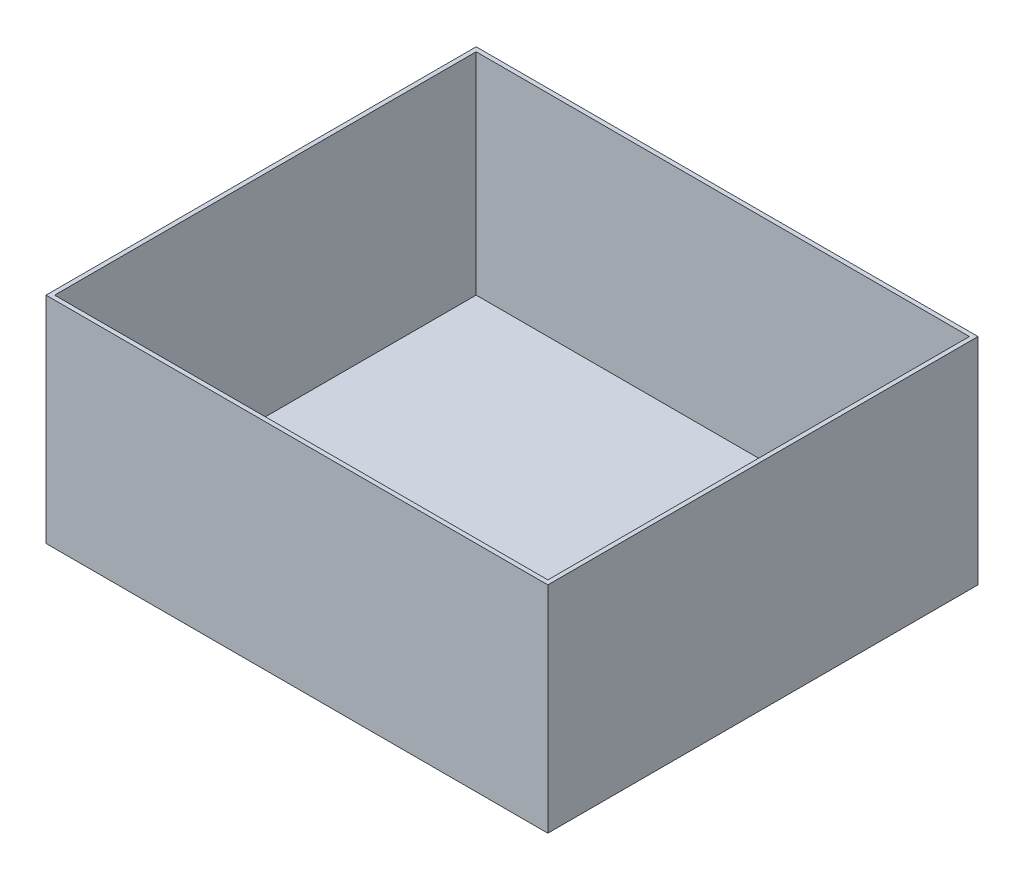
ISO-10303-21;
HEADER;
FILE_DESCRIPTION(('STEP AP214'),'2;1');
FILE_NAME('part.step','',(''),(''),'','','');
FILE_SCHEMA(('AUTOMOTIVE_DESIGN { 1 0 10303 214 1 1 1 1 }'));
ENDSEC;
DATA;
#1=APPLICATION_CONTEXT('core data for automotive mechanical design processes');
#2=APPLICATION_PROTOCOL_DEFINITION('international standard','automotive_design',2000,#1);
#3=PRODUCT_CONTEXT('',#1,'mechanical');
#4=PRODUCT('Part','Part','',(#3));
#5=PRODUCT_RELATED_PRODUCT_CATEGORY('part','',(#4));
#6=PRODUCT_DEFINITION_FORMATION('','',#4);
#7=PRODUCT_DEFINITION_CONTEXT('part definition',#1,'design');
#8=PRODUCT_DEFINITION('design','',#6,#7);
#9=PRODUCT_DEFINITION_SHAPE('','',#8);
#10=(LENGTH_UNIT() NAMED_UNIT(*) SI_UNIT(.MILLI.,.METRE.));
#11=(NAMED_UNIT(*) PLANE_ANGLE_UNIT() SI_UNIT($,.RADIAN.));
#12=(NAMED_UNIT(*) SI_UNIT($,.STERADIAN.) SOLID_ANGLE_UNIT());
#13=UNCERTAINTY_MEASURE_WITH_UNIT(LENGTH_MEASURE(1.E-05),#10,'distance_accuracy_value','');
#14=(GEOMETRIC_REPRESENTATION_CONTEXT(3) GLOBAL_UNCERTAINTY_ASSIGNED_CONTEXT((#13)) GLOBAL_UNIT_ASSIGNED_CONTEXT((#10,
#11,#12)) REPRESENTATION_CONTEXT('',''));
#15=CARTESIAN_POINT('',(0.,0.,0.));
#16=DIRECTION('',(0.,0.,1.));
#17=DIRECTION('',(1.,0.,0.));
#18=AXIS2_PLACEMENT_3D('',#15,#16,#17);
#19=CARTESIAN_POINT('',(0.,150.,0.));
#20=DIRECTION('',(0.,1.,0.));
#21=DIRECTION('',(0.,0.,1.));
#22=AXIS2_PLACEMENT_3D('',#19,#20,#21);
#23=PLANE('',#22);
#24=DIRECTION('',(1.,0.,0.));
#25=VECTOR('',#24,1.);
#26=CARTESIAN_POINT('',(0.,150.,150.));
#27=LINE('',#26,#25);
#28=CARTESIAN_POINT('',(-175.,150.,150.));
#29=VERTEX_POINT('',#28);
#30=CARTESIAN_POINT('',(175.,150.,150.));
#31=VERTEX_POINT('',#30);
#32=EDGE_CURVE('E164',#29,#31,#27,.T.);
#33=ORIENTED_EDGE('',*,*,#32,.T.);
#34=DIRECTION('',(0.,0.,-1.));
#35=VECTOR('',#34,1.);
#36=CARTESIAN_POINT('',(175.,150.,0.));
#37=LINE('',#36,#35);
#38=CARTESIAN_POINT('',(175.,150.,-150.));
#39=VERTEX_POINT('',#38);
#40=EDGE_CURVE('E168',#31,#39,#37,.T.);
#41=ORIENTED_EDGE('',*,*,#40,.T.);
#42=DIRECTION('',(1.,0.,0.));
#43=VECTOR('',#42,1.);
#44=CARTESIAN_POINT('',(0.,150.,-150.));
#45=LINE('',#44,#43);
#46=CARTESIAN_POINT('',(-175.,150.,-150.));
#47=VERTEX_POINT('',#46);
#48=EDGE_CURVE('E172',#47,#39,#45,.T.);
#49=ORIENTED_EDGE('',*,*,#48,.F.);
#50=DIRECTION('',(0.,0.,-1.));
#51=VECTOR('',#50,1.);
#52=CARTESIAN_POINT('',(-175.,150.,0.));
#53=LINE('',#52,#51);
#54=EDGE_CURVE('E176',#29,#47,#53,.T.);
#55=ORIENTED_EDGE('',*,*,#54,.F.);
#56=EDGE_LOOP('',(#33,#41,#49,#55));
#57=FACE_BOUND('',#56,.T.);
#58=DIRECTION('',(0.,0.,-1.));
#59=VECTOR('',#58,1.);
#60=CARTESIAN_POINT('',(172.,150.,0.));
#61=LINE('',#60,#59);
#62=CARTESIAN_POINT('',(172.,150.,147.));
#63=VERTEX_POINT('',#62);
#64=CARTESIAN_POINT('',(172.,150.,-147.));
#65=VERTEX_POINT('',#64);
#66=EDGE_CURVE('E226',#63,#65,#61,.T.);
#67=ORIENTED_EDGE('',*,*,#66,.F.);
#68=DIRECTION('',(1.,0.,0.));
#69=VECTOR('',#68,1.);
#70=CARTESIAN_POINT('',(0.,150.,147.));
#71=LINE('',#70,#69);
#72=CARTESIAN_POINT('',(-172.,150.,147.));
#73=VERTEX_POINT('',#72);
#74=EDGE_CURVE('E141',#73,#63,#71,.T.);
#75=ORIENTED_EDGE('',*,*,#74,.F.);
#76=DIRECTION('',(0.,0.,-1.));
#77=VECTOR('',#76,1.);
#78=CARTESIAN_POINT('',(-172.,150.,0.));
#79=LINE('',#78,#77);
#80=CARTESIAN_POINT('',(-172.,150.,-147.));
#81=VERTEX_POINT('',#80);
#82=EDGE_CURVE('E146',#73,#81,#79,.T.);
#83=ORIENTED_EDGE('',*,*,#82,.T.);
#84=DIRECTION('',(1.,0.,0.));
#85=VECTOR('',#84,1.);
#86=CARTESIAN_POINT('',(0.,150.,-147.));
#87=LINE('',#86,#85);
#88=EDGE_CURVE('E86',#81,#65,#87,.T.);
#89=ORIENTED_EDGE('',*,*,#88,.T.);
#90=EDGE_LOOP('',(#67,#75,#83,#89));
#91=FACE_BOUND('',#90,.T.);
#92=ADVANCED_FACE('F63',(#57,#91),#23,.T.);
#93=CARTESIAN_POINT('',(0.,0.,0.));
#94=DIRECTION('',(0.,1.,0.));
#95=DIRECTION('',(0.,0.,1.));
#96=AXIS2_PLACEMENT_3D('',#93,#94,#95);
#97=PLANE('',#96);
#98=DIRECTION('',(1.,0.,0.));
#99=VECTOR('',#98,1.);
#100=CARTESIAN_POINT('',(0.,0.,150.));
#101=LINE('',#100,#99);
#102=CARTESIAN_POINT('',(-175.,0.,150.));
#103=VERTEX_POINT('',#102);
#104=CARTESIAN_POINT('',(175.,0.,150.));
#105=VERTEX_POINT('',#104);
#106=EDGE_CURVE('E163',#103,#105,#101,.T.);
#107=ORIENTED_EDGE('',*,*,#106,.F.);
#108=DIRECTION('',(0.,0.,-1.));
#109=VECTOR('',#108,1.);
#110=CARTESIAN_POINT('',(-175.,0.,0.));
#111=LINE('',#110,#109);
#112=CARTESIAN_POINT('',(-175.,0.,-150.));
#113=VERTEX_POINT('',#112);
#114=EDGE_CURVE('E169',#103,#113,#111,.T.);
#115=ORIENTED_EDGE('',*,*,#114,.T.);
#116=DIRECTION('',(1.,0.,0.));
#117=VECTOR('',#116,1.);
#118=CARTESIAN_POINT('',(0.,0.,-150.));
#119=LINE('',#118,#117);
#120=CARTESIAN_POINT('',(175.,0.,-150.));
#121=VERTEX_POINT('',#120);
#122=EDGE_CURVE('E188',#113,#121,#119,.T.);
#123=ORIENTED_EDGE('',*,*,#122,.T.);
#124=DIRECTION('',(0.,0.,-1.));
#125=VECTOR('',#124,1.);
#126=CARTESIAN_POINT('',(175.,0.,0.));
#127=LINE('',#126,#125);
#128=EDGE_CURVE('E184',#105,#121,#127,.T.);
#129=ORIENTED_EDGE('',*,*,#128,.F.);
#130=EDGE_LOOP('',(#107,#115,#123,#129));
#131=FACE_BOUND('',#130,.T.);
#132=ADVANCED_FACE('F212',(#131),#97,.F.);
#133=CARTESIAN_POINT('',(0.,150.,150.));
#134=DIRECTION('',(0.,0.,-1.));
#135=DIRECTION('',(-1.,0.,0.));
#136=AXIS2_PLACEMENT_3D('',#133,#134,#135);
#137=PLANE('',#136);
#138=DIRECTION('',(0.,-1.,0.));
#139=VECTOR('',#138,1.);
#140=CARTESIAN_POINT('',(-175.,150.,150.));
#141=LINE('',#140,#139);
#142=EDGE_CURVE('E180',#29,#103,#141,.T.);
#143=ORIENTED_EDGE('',*,*,#142,.T.);
#144=ORIENTED_EDGE('',*,*,#106,.T.);
#145=DIRECTION('',(0.,-1.,0.));
#146=VECTOR('',#145,1.);
#147=CARTESIAN_POINT('',(175.,150.,150.));
#148=LINE('',#147,#146);
#149=EDGE_CURVE('E72',#31,#105,#148,.T.);
#150=ORIENTED_EDGE('',*,*,#149,.F.);
#151=ORIENTED_EDGE('',*,*,#32,.F.);
#152=EDGE_LOOP('',(#143,#144,#150,#151));
#153=FACE_BOUND('',#152,.T.);
#154=ADVANCED_FACE('F65',(#153),#137,.F.);
#155=CARTESIAN_POINT('',(175.,150.,0.));
#156=DIRECTION('',(-1.,0.,0.));
#157=DIRECTION('',(0.,0.,1.));
#158=AXIS2_PLACEMENT_3D('',#155,#156,#157);
#159=PLANE('',#158);
#160=ORIENTED_EDGE('',*,*,#149,.T.);
#161=ORIENTED_EDGE('',*,*,#128,.T.);
#162=DIRECTION('',(0.,-1.,0.));
#163=VECTOR('',#162,1.);
#164=CARTESIAN_POINT('',(175.,150.,-150.));
#165=LINE('',#164,#163);
#166=EDGE_CURVE('E200',#39,#121,#165,.T.);
#167=ORIENTED_EDGE('',*,*,#166,.F.);
#168=ORIENTED_EDGE('',*,*,#40,.F.);
#169=EDGE_LOOP('',(#160,#161,#167,#168));
#170=FACE_BOUND('',#169,.T.);
#171=ADVANCED_FACE('F206',(#170),#159,.F.);
#172=CARTESIAN_POINT('',(0.,150.,-150.));
#173=DIRECTION('',(0.,0.,-1.));
#174=DIRECTION('',(-1.,0.,0.));
#175=AXIS2_PLACEMENT_3D('',#172,#173,#174);
#176=PLANE('',#175);
#177=ORIENTED_EDGE('',*,*,#166,.T.);
#178=ORIENTED_EDGE('',*,*,#122,.F.);
#179=DIRECTION('',(0.,-1.,0.));
#180=VECTOR('',#179,1.);
#181=CARTESIAN_POINT('',(-175.,150.,-150.));
#182=LINE('',#181,#180);
#183=EDGE_CURVE('E197',#47,#113,#182,.T.);
#184=ORIENTED_EDGE('',*,*,#183,.F.);
#185=ORIENTED_EDGE('',*,*,#48,.T.);
#186=EDGE_LOOP('',(#177,#178,#184,#185));
#187=FACE_BOUND('',#186,.T.);
#188=ADVANCED_FACE('F220',(#187),#176,.T.);
#189=CARTESIAN_POINT('',(-175.,150.,0.));
#190=DIRECTION('',(-1.,0.,0.));
#191=DIRECTION('',(0.,0.,1.));
#192=AXIS2_PLACEMENT_3D('',#189,#190,#191);
#193=PLANE('',#192);
#194=ORIENTED_EDGE('',*,*,#183,.T.);
#195=ORIENTED_EDGE('',*,*,#114,.F.);
#196=ORIENTED_EDGE('',*,*,#142,.F.);
#197=ORIENTED_EDGE('',*,*,#54,.T.);
#198=EDGE_LOOP('',(#194,#195,#196,#197));
#199=FACE_BOUND('',#198,.T.);
#200=ADVANCED_FACE('F217',(#199),#193,.T.);
#201=CARTESIAN_POINT('',(0.,150.,147.));
#202=DIRECTION('',(0.,0.,-1.));
#203=DIRECTION('',(-1.,0.,0.));
#204=AXIS2_PLACEMENT_3D('',#201,#202,#203);
#205=PLANE('',#204);
#206=DIRECTION('',(1.,0.,0.));
#207=VECTOR('',#206,1.);
#208=CARTESIAN_POINT('',(0.,3.,147.));
#209=LINE('',#208,#207);
#210=CARTESIAN_POINT('',(-172.,3.,147.));
#211=VERTEX_POINT('',#210);
#212=CARTESIAN_POINT('',(172.,3.,147.));
#213=VERTEX_POINT('',#212);
#214=EDGE_CURVE('E129',#211,#213,#209,.T.);
#215=ORIENTED_EDGE('',*,*,#214,.F.);
#216=DIRECTION('',(0.,-1.,0.));
#217=VECTOR('',#216,1.);
#218=CARTESIAN_POINT('',(-172.,150.,147.));
#219=LINE('',#218,#217);
#220=EDGE_CURVE('E136',#73,#211,#219,.T.);
#221=ORIENTED_EDGE('',*,*,#220,.F.);
#222=ORIENTED_EDGE('',*,*,#74,.T.);
#223=DIRECTION('',(0.,-1.,0.));
#224=VECTOR('',#223,1.);
#225=CARTESIAN_POINT('',(172.,150.,147.));
#226=LINE('',#225,#224);
#227=EDGE_CURVE('E139',#63,#213,#226,.T.);
#228=ORIENTED_EDGE('',*,*,#227,.T.);
#229=EDGE_LOOP('',(#215,#221,#222,#228));
#230=FACE_BOUND('',#229,.T.);
#231=ADVANCED_FACE('F135',(#230),#205,.T.);
#232=CARTESIAN_POINT('',(172.,150.,0.));
#233=DIRECTION('',(-1.,0.,0.));
#234=DIRECTION('',(0.,0.,1.));
#235=AXIS2_PLACEMENT_3D('',#232,#233,#234);
#236=PLANE('',#235);
#237=DIRECTION('',(0.,0.,-1.));
#238=VECTOR('',#237,1.);
#239=CARTESIAN_POINT('',(172.,3.,0.));
#240=LINE('',#239,#238);
#241=CARTESIAN_POINT('',(172.,3.,-147.));
#242=VERTEX_POINT('',#241);
#243=EDGE_CURVE('E142',#213,#242,#240,.T.);
#244=ORIENTED_EDGE('',*,*,#243,.F.);
#245=ORIENTED_EDGE('',*,*,#227,.F.);
#246=ORIENTED_EDGE('',*,*,#66,.T.);
#247=DIRECTION('',(0.,-1.,0.));
#248=VECTOR('',#247,1.);
#249=CARTESIAN_POINT('',(172.,150.,-147.));
#250=LINE('',#249,#248);
#251=EDGE_CURVE('E153',#65,#242,#250,.T.);
#252=ORIENTED_EDGE('',*,*,#251,.T.);
#253=EDGE_LOOP('',(#244,#245,#246,#252));
#254=FACE_BOUND('',#253,.T.);
#255=ADVANCED_FACE('F238',(#254),#236,.T.);
#256=CARTESIAN_POINT('',(0.,150.,-147.));
#257=DIRECTION('',(0.,0.,-1.));
#258=DIRECTION('',(-1.,0.,0.));
#259=AXIS2_PLACEMENT_3D('',#256,#257,#258);
#260=PLANE('',#259);
#261=DIRECTION('',(0.,-1.,0.));
#262=VECTOR('',#261,1.);
#263=CARTESIAN_POINT('',(-172.,150.,-147.));
#264=LINE('',#263,#262);
#265=CARTESIAN_POINT('',(-172.,3.,-147.));
#266=VERTEX_POINT('',#265);
#267=EDGE_CURVE('E149',#81,#266,#264,.T.);
#268=ORIENTED_EDGE('',*,*,#267,.T.);
#269=DIRECTION('',(1.,0.,0.));
#270=VECTOR('',#269,1.);
#271=CARTESIAN_POINT('',(0.,3.,-147.));
#272=LINE('',#271,#270);
#273=EDGE_CURVE('E79',#266,#242,#272,.T.);
#274=ORIENTED_EDGE('',*,*,#273,.T.);
#275=ORIENTED_EDGE('',*,*,#251,.F.);
#276=ORIENTED_EDGE('',*,*,#88,.F.);
#277=EDGE_LOOP('',(#268,#274,#275,#276));
#278=FACE_BOUND('',#277,.T.);
#279=ADVANCED_FACE('F237',(#278),#260,.F.);
#280=CARTESIAN_POINT('',(-172.,150.,0.));
#281=DIRECTION('',(-1.,0.,0.));
#282=DIRECTION('',(0.,0.,1.));
#283=AXIS2_PLACEMENT_3D('',#280,#281,#282);
#284=PLANE('',#283);
#285=ORIENTED_EDGE('',*,*,#220,.T.);
#286=DIRECTION('',(0.,0.,-1.));
#287=VECTOR('',#286,1.);
#288=CARTESIAN_POINT('',(-172.,3.,0.));
#289=LINE('',#288,#287);
#290=EDGE_CURVE('E12',#211,#266,#289,.T.);
#291=ORIENTED_EDGE('',*,*,#290,.T.);
#292=ORIENTED_EDGE('',*,*,#267,.F.);
#293=ORIENTED_EDGE('',*,*,#82,.F.);
#294=EDGE_LOOP('',(#285,#291,#292,#293));
#295=FACE_BOUND('',#294,.T.);
#296=ADVANCED_FACE('F144',(#295),#284,.F.);
#297=CARTESIAN_POINT('',(0.,3.,0.));
#298=DIRECTION('',(0.,1.,0.));
#299=DIRECTION('',(0.,0.,1.));
#300=AXIS2_PLACEMENT_3D('',#297,#298,#299);
#301=PLANE('',#300);
#302=ORIENTED_EDGE('',*,*,#290,.F.);
#303=ORIENTED_EDGE('',*,*,#214,.T.);
#304=ORIENTED_EDGE('',*,*,#243,.T.);
#305=ORIENTED_EDGE('',*,*,#273,.F.);
#306=EDGE_LOOP('',(#302,#303,#304,#305));
#307=FACE_BOUND('',#306,.T.);
#308=ADVANCED_FACE('F128',(#307),#301,.T.);
#309=CLOSED_SHELL('',(#92,#132,#154,#171,#188,#200,#231,#255,#279,#296,#308));
#310=MANIFOLD_SOLID_BREP('B2',#309);
#311=ADVANCED_BREP_SHAPE_REPRESENTATION('',(#18,#310),#14);
#312=SHAPE_DEFINITION_REPRESENTATION(#9,#311);
ENDSEC;
END-ISO-10303-21;
